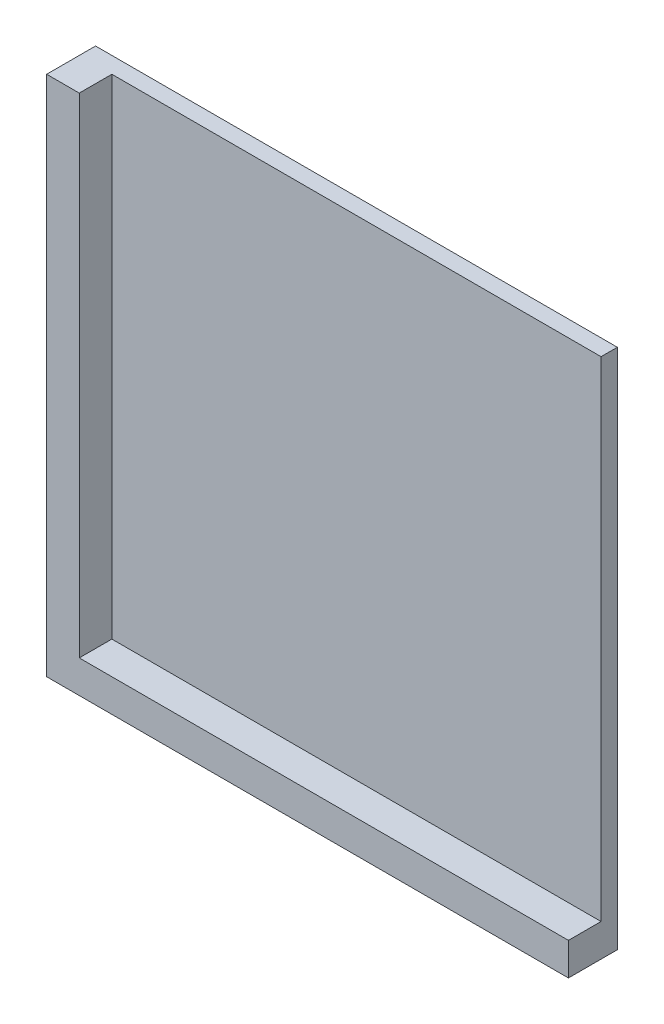
ISO-10303-21;
HEADER;
FILE_DESCRIPTION(('STEP AP214'),'2;1');
FILE_NAME('part.step','',(''),(''),'','','');
FILE_SCHEMA(('AUTOMOTIVE_DESIGN { 1 0 10303 214 1 1 1 1 }'));
ENDSEC;
DATA;
#1=APPLICATION_CONTEXT('core data for automotive mechanical design processes');
#2=APPLICATION_PROTOCOL_DEFINITION('international standard','automotive_design',2000,#1);
#3=PRODUCT_CONTEXT('',#1,'mechanical');
#4=PRODUCT('Part','Part','',(#3));
#5=PRODUCT_RELATED_PRODUCT_CATEGORY('part','',(#4));
#6=PRODUCT_DEFINITION_FORMATION('','',#4);
#7=PRODUCT_DEFINITION_CONTEXT('part definition',#1,'design');
#8=PRODUCT_DEFINITION('design','',#6,#7);
#9=PRODUCT_DEFINITION_SHAPE('','',#8);
#10=(LENGTH_UNIT() NAMED_UNIT(*) SI_UNIT(.MILLI.,.METRE.));
#11=(NAMED_UNIT(*) PLANE_ANGLE_UNIT() SI_UNIT($,.RADIAN.));
#12=(NAMED_UNIT(*) SI_UNIT($,.STERADIAN.) SOLID_ANGLE_UNIT());
#13=UNCERTAINTY_MEASURE_WITH_UNIT(LENGTH_MEASURE(1.E-05),#10,'distance_accuracy_value','');
#14=(GEOMETRIC_REPRESENTATION_CONTEXT(3) GLOBAL_UNCERTAINTY_ASSIGNED_CONTEXT((#13)) GLOBAL_UNIT_ASSIGNED_CONTEXT((#10,
#11,#12)) REPRESENTATION_CONTEXT('',''));
#15=CARTESIAN_POINT('',(0.,0.,0.));
#16=DIRECTION('',(0.,0.,1.));
#17=DIRECTION('',(1.,0.,0.));
#18=AXIS2_PLACEMENT_3D('',#15,#16,#17);
#19=CARTESIAN_POINT('',(0.,-177.8,25.4));
#20=DIRECTION('',(0.,1.,0.));
#21=DIRECTION('',(0.,0.,1.));
#22=AXIS2_PLACEMENT_3D('',#19,#20,#21);
#23=PLANE('',#22);
#24=DIRECTION('',(1.,0.,0.));
#25=VECTOR('',#24,1.);
#26=CARTESIAN_POINT('',(0.,-177.8,0.));
#27=LINE('',#26,#25);
#28=CARTESIAN_POINT('',(-177.8,-177.8,0.));
#29=VERTEX_POINT('',#28);
#30=CARTESIAN_POINT('',(203.2,-177.8,0.));
#31=VERTEX_POINT('',#30);
#32=EDGE_CURVE('E129',#29,#31,#27,.T.);
#33=ORIENTED_EDGE('',*,*,#32,.F.);
#34=DIRECTION('',(0.,0.,-1.));
#35=VECTOR('',#34,1.);
#36=CARTESIAN_POINT('',(-177.8,-177.8,25.4));
#37=LINE('',#36,#35);
#38=CARTESIAN_POINT('',(-177.8,-177.8,25.4));
#39=VERTEX_POINT('',#38);
#40=EDGE_CURVE('E11',#39,#29,#37,.T.);
#41=ORIENTED_EDGE('',*,*,#40,.F.);
#42=DIRECTION('',(1.,0.,0.));
#43=VECTOR('',#42,1.);
#44=CARTESIAN_POINT('',(0.,-177.8,25.4));
#45=LINE('',#44,#43);
#46=CARTESIAN_POINT('',(203.2,-177.8,25.4));
#47=VERTEX_POINT('',#46);
#48=EDGE_CURVE('E130',#39,#47,#45,.T.);
#49=ORIENTED_EDGE('',*,*,#48,.T.);
#50=DIRECTION('',(0.,0.,-1.));
#51=VECTOR('',#50,1.);
#52=CARTESIAN_POINT('',(203.2,-177.8,25.4));
#53=LINE('',#52,#51);
#54=EDGE_CURVE('E55',#47,#31,#53,.T.);
#55=ORIENTED_EDGE('',*,*,#54,.T.);
#56=EDGE_LOOP('',(#33,#41,#49,#55));
#57=FACE_BOUND('',#56,.T.);
#58=ADVANCED_FACE('F40',(#57),#23,.T.);
#59=CARTESIAN_POINT('',(-177.8,0.,25.4));
#60=DIRECTION('',(-1.,0.,0.));
#61=DIRECTION('',(0.,0.,1.));
#62=AXIS2_PLACEMENT_3D('',#59,#60,#61);
#63=PLANE('',#62);
#64=DIRECTION('',(0.,1.,0.));
#65=VECTOR('',#64,1.);
#66=CARTESIAN_POINT('',(-177.8,0.,0.));
#67=LINE('',#66,#65);
#68=CARTESIAN_POINT('',(-177.8,203.2,0.));
#69=VERTEX_POINT('',#68);
#70=EDGE_CURVE('E133',#29,#69,#67,.T.);
#71=ORIENTED_EDGE('',*,*,#70,.T.);
#72=DIRECTION('',(0.,0.,-1.));
#73=VECTOR('',#72,1.);
#74=CARTESIAN_POINT('',(-177.8,203.2,25.4));
#75=LINE('',#74,#73);
#76=CARTESIAN_POINT('',(-177.8,203.2,25.4));
#77=VERTEX_POINT('',#76);
#78=EDGE_CURVE('E48',#77,#69,#75,.T.);
#79=ORIENTED_EDGE('',*,*,#78,.F.);
#80=DIRECTION('',(0.,1.,0.));
#81=VECTOR('',#80,1.);
#82=CARTESIAN_POINT('',(-177.8,0.,25.4));
#83=LINE('',#82,#81);
#84=EDGE_CURVE('E132',#39,#77,#83,.T.);
#85=ORIENTED_EDGE('',*,*,#84,.F.);
#86=ORIENTED_EDGE('',*,*,#40,.T.);
#87=EDGE_LOOP('',(#71,#79,#85,#86));
#88=FACE_BOUND('',#87,.T.);
#89=ADVANCED_FACE('F157',(#88),#63,.F.);
#90=CARTESIAN_POINT('',(0.,203.2,25.4));
#91=DIRECTION('',(0.,1.,0.));
#92=DIRECTION('',(0.,0.,1.));
#93=AXIS2_PLACEMENT_3D('',#90,#91,#92);
#94=PLANE('',#93);
#95=ORIENTED_EDGE('',*,*,#78,.T.);
#96=DIRECTION('',(1.,0.,0.));
#97=VECTOR('',#96,1.);
#98=CARTESIAN_POINT('',(0.,203.2,0.));
#99=LINE('',#98,#97);
#100=CARTESIAN_POINT('',(203.2,203.2,0.));
#101=VERTEX_POINT('',#100);
#102=EDGE_CURVE('E118',#69,#101,#99,.T.);
#103=ORIENTED_EDGE('',*,*,#102,.T.);
#104=DIRECTION('',(0.,0.,1.));
#105=VECTOR('',#104,1.);
#106=CARTESIAN_POINT('',(203.2,203.2,-12.7));
#107=LINE('',#106,#105);
#108=CARTESIAN_POINT('',(203.2,203.2,-12.7));
#109=VERTEX_POINT('',#108);
#110=EDGE_CURVE('E126',#109,#101,#107,.T.);
#111=ORIENTED_EDGE('',*,*,#110,.F.);
#112=DIRECTION('',(1.,0.,0.));
#113=VECTOR('',#112,1.);
#114=CARTESIAN_POINT('',(0.,203.2,-12.7));
#115=LINE('',#114,#113);
#116=CARTESIAN_POINT('',(-203.2,203.2,-12.7));
#117=VERTEX_POINT('',#116);
#118=EDGE_CURVE('E113',#117,#109,#115,.T.);
#119=ORIENTED_EDGE('',*,*,#118,.F.);
#120=DIRECTION('',(0.,0.,-1.));
#121=VECTOR('',#120,1.);
#122=CARTESIAN_POINT('',(-203.2,203.2,25.4));
#123=LINE('',#122,#121);
#124=CARTESIAN_POINT('',(-203.2,203.2,25.4));
#125=VERTEX_POINT('',#124);
#126=EDGE_CURVE('E148',#125,#117,#123,.T.);
#127=ORIENTED_EDGE('',*,*,#126,.F.);
#128=DIRECTION('',(1.,0.,0.));
#129=VECTOR('',#128,1.);
#130=CARTESIAN_POINT('',(0.,203.2,25.4));
#131=LINE('',#130,#129);
#132=EDGE_CURVE('E135',#125,#77,#131,.T.);
#133=ORIENTED_EDGE('',*,*,#132,.T.);
#134=EDGE_LOOP('',(#95,#103,#111,#119,#127,#133));
#135=FACE_BOUND('',#134,.T.);
#136=ADVANCED_FACE('F152',(#135),#94,.T.);
#137=CARTESIAN_POINT('',(-203.2,0.,25.4));
#138=DIRECTION('',(1.,0.,0.));
#139=DIRECTION('',(0.,0.,-1.));
#140=AXIS2_PLACEMENT_3D('',#137,#138,#139);
#141=PLANE('',#140);
#142=ORIENTED_EDGE('',*,*,#126,.T.);
#143=DIRECTION('',(0.,-1.,0.));
#144=VECTOR('',#143,1.);
#145=CARTESIAN_POINT('',(-203.2,0.,-12.7));
#146=LINE('',#145,#144);
#147=CARTESIAN_POINT('',(-203.2,-203.2,-12.7));
#148=VERTEX_POINT('',#147);
#149=EDGE_CURVE('E124',#117,#148,#146,.T.);
#150=ORIENTED_EDGE('',*,*,#149,.T.);
#151=DIRECTION('',(0.,0.,-1.));
#152=VECTOR('',#151,1.);
#153=CARTESIAN_POINT('',(-203.2,-203.2,25.4));
#154=LINE('',#153,#152);
#155=CARTESIAN_POINT('',(-203.2,-203.2,25.4));
#156=VERTEX_POINT('',#155);
#157=EDGE_CURVE('E104',#156,#148,#154,.T.);
#158=ORIENTED_EDGE('',*,*,#157,.F.);
#159=DIRECTION('',(0.,-1.,0.));
#160=VECTOR('',#159,1.);
#161=CARTESIAN_POINT('',(-203.2,0.,25.4));
#162=LINE('',#161,#160);
#163=EDGE_CURVE('E138',#125,#156,#162,.T.);
#164=ORIENTED_EDGE('',*,*,#163,.F.);
#165=EDGE_LOOP('',(#142,#150,#158,#164));
#166=FACE_BOUND('',#165,.T.);
#167=ADVANCED_FACE('F168',(#166),#141,.F.);
#168=CARTESIAN_POINT('',(0.,-203.2,25.4));
#169=DIRECTION('',(0.,1.,0.));
#170=DIRECTION('',(0.,0.,1.));
#171=AXIS2_PLACEMENT_3D('',#168,#169,#170);
#172=PLANE('',#171);
#173=ORIENTED_EDGE('',*,*,#157,.T.);
#174=DIRECTION('',(1.,0.,0.));
#175=VECTOR('',#174,1.);
#176=CARTESIAN_POINT('',(0.,-203.2,-12.7));
#177=LINE('',#176,#175);
#178=CARTESIAN_POINT('',(203.2,-203.2,-12.7));
#179=VERTEX_POINT('',#178);
#180=EDGE_CURVE('E110',#148,#179,#177,.T.);
#181=ORIENTED_EDGE('',*,*,#180,.T.);
#182=DIRECTION('',(0.,0.,-1.));
#183=VECTOR('',#182,1.);
#184=CARTESIAN_POINT('',(203.2,-203.2,25.4));
#185=LINE('',#184,#183);
#186=CARTESIAN_POINT('',(203.2,-203.2,25.4));
#187=VERTEX_POINT('',#186);
#188=EDGE_CURVE('E94',#187,#179,#185,.T.);
#189=ORIENTED_EDGE('',*,*,#188,.F.);
#190=DIRECTION('',(1.,0.,0.));
#191=VECTOR('',#190,1.);
#192=CARTESIAN_POINT('',(0.,-203.2,25.4));
#193=LINE('',#192,#191);
#194=EDGE_CURVE('E140',#156,#187,#193,.T.);
#195=ORIENTED_EDGE('',*,*,#194,.F.);
#196=EDGE_LOOP('',(#173,#181,#189,#195));
#197=FACE_BOUND('',#196,.T.);
#198=ADVANCED_FACE('F116',(#197),#172,.F.);
#199=CARTESIAN_POINT('',(203.2,0.,25.4));
#200=DIRECTION('',(1.,0.,0.));
#201=DIRECTION('',(0.,0.,-1.));
#202=AXIS2_PLACEMENT_3D('',#199,#200,#201);
#203=PLANE('',#202);
#204=ORIENTED_EDGE('',*,*,#188,.T.);
#205=DIRECTION('',(0.,-1.,0.));
#206=VECTOR('',#205,1.);
#207=CARTESIAN_POINT('',(203.2,0.,-12.7));
#208=LINE('',#207,#206);
#209=EDGE_CURVE('E98',#109,#179,#208,.T.);
#210=ORIENTED_EDGE('',*,*,#209,.F.);
#211=ORIENTED_EDGE('',*,*,#110,.T.);
#212=DIRECTION('',(0.,-1.,0.));
#213=VECTOR('',#212,1.);
#214=CARTESIAN_POINT('',(203.2,0.,0.));
#215=LINE('',#214,#213);
#216=EDGE_CURVE('E120',#101,#31,#215,.T.);
#217=ORIENTED_EDGE('',*,*,#216,.T.);
#218=ORIENTED_EDGE('',*,*,#54,.F.);
#219=DIRECTION('',(0.,-1.,0.));
#220=VECTOR('',#219,1.);
#221=CARTESIAN_POINT('',(203.2,0.,25.4));
#222=LINE('',#221,#220);
#223=EDGE_CURVE('E100',#47,#187,#222,.T.);
#224=ORIENTED_EDGE('',*,*,#223,.T.);
#225=EDGE_LOOP('',(#204,#210,#211,#217,#218,#224));
#226=FACE_BOUND('',#225,.T.);
#227=ADVANCED_FACE('F96',(#226),#203,.T.);
#228=CARTESIAN_POINT('',(0.,0.,25.4));
#229=DIRECTION('',(0.,0.,1.));
#230=DIRECTION('',(1.,0.,0.));
#231=AXIS2_PLACEMENT_3D('',#228,#229,#230);
#232=PLANE('',#231);
#233=ORIENTED_EDGE('',*,*,#48,.F.);
#234=ORIENTED_EDGE('',*,*,#84,.T.);
#235=ORIENTED_EDGE('',*,*,#132,.F.);
#236=ORIENTED_EDGE('',*,*,#163,.T.);
#237=ORIENTED_EDGE('',*,*,#194,.T.);
#238=ORIENTED_EDGE('',*,*,#223,.F.);
#239=EDGE_LOOP('',(#233,#234,#235,#236,#237,#238));
#240=FACE_BOUND('',#239,.T.);
#241=ADVANCED_FACE('F165',(#240),#232,.T.);
#242=CARTESIAN_POINT('',(0.,0.,-12.7));
#243=DIRECTION('',(0.,0.,1.));
#244=DIRECTION('',(1.,0.,0.));
#245=AXIS2_PLACEMENT_3D('',#242,#243,#244);
#246=PLANE('',#245);
#247=ORIENTED_EDGE('',*,*,#180,.F.);
#248=ORIENTED_EDGE('',*,*,#149,.F.);
#249=ORIENTED_EDGE('',*,*,#118,.T.);
#250=ORIENTED_EDGE('',*,*,#209,.T.);
#251=EDGE_LOOP('',(#247,#248,#249,#250));
#252=FACE_BOUND('',#251,.T.);
#253=ADVANCED_FACE('F108',(#252),#246,.F.);
#254=CARTESIAN_POINT('',(0.,0.,0.));
#255=DIRECTION('',(0.,0.,1.));
#256=DIRECTION('',(1.,0.,0.));
#257=AXIS2_PLACEMENT_3D('',#254,#255,#256);
#258=PLANE('',#257);
#259=ORIENTED_EDGE('',*,*,#70,.F.);
#260=ORIENTED_EDGE('',*,*,#32,.T.);
#261=ORIENTED_EDGE('',*,*,#216,.F.);
#262=ORIENTED_EDGE('',*,*,#102,.F.);
#263=EDGE_LOOP('',(#259,#260,#261,#262));
#264=FACE_BOUND('',#263,.T.);
#265=ADVANCED_FACE('F160',(#264),#258,.T.);
#266=CLOSED_SHELL('',(#58,#89,#136,#167,#198,#227,#241,#253,#265));
#267=MANIFOLD_SOLID_BREP('B2',#266);
#268=ADVANCED_BREP_SHAPE_REPRESENTATION('',(#18,#267),#14);
#269=SHAPE_DEFINITION_REPRESENTATION(#9,#268);
ENDSEC;
END-ISO-10303-21;
